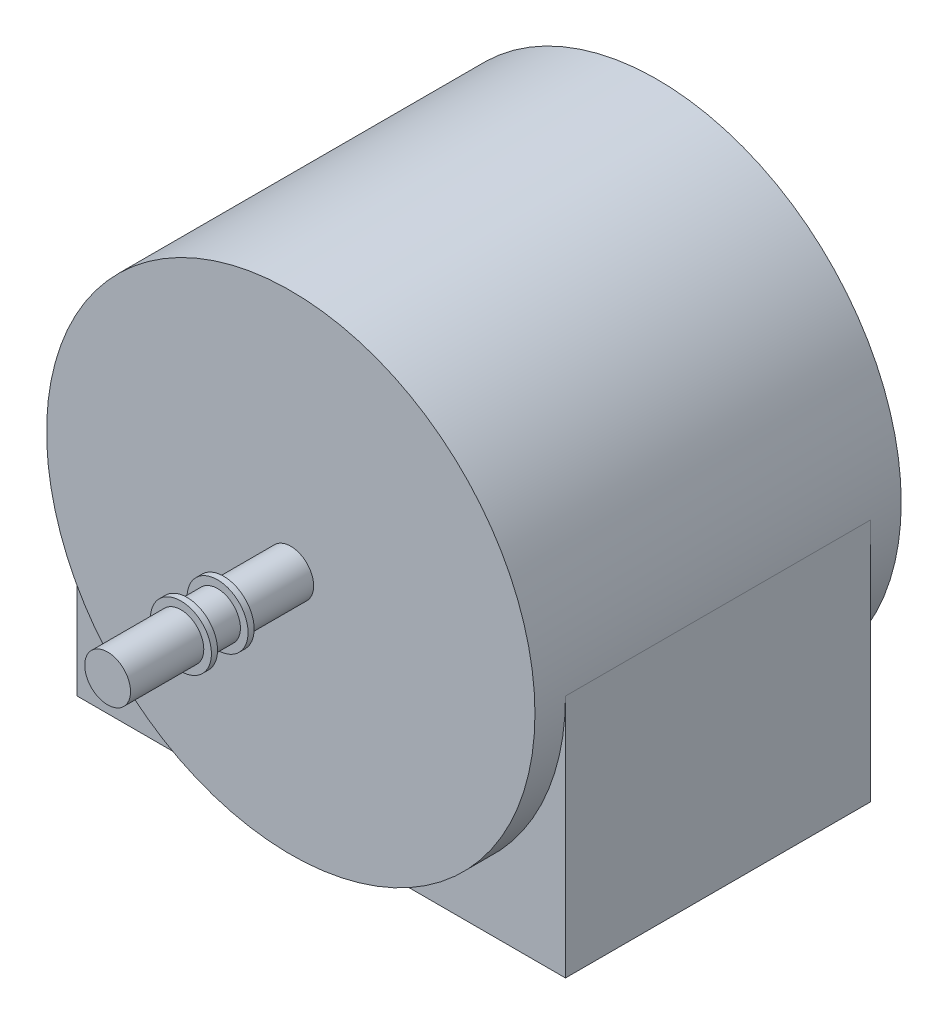
ISO-10303-21;
HEADER;
FILE_DESCRIPTION(('STEP AP214'),'2;1');
FILE_NAME('part.step','',(''),(''),'','','');
FILE_SCHEMA(('AUTOMOTIVE_DESIGN { 1 0 10303 214 1 1 1 1 }'));
ENDSEC;
DATA;
#1=APPLICATION_CONTEXT('core data for automotive mechanical design processes');
#2=APPLICATION_PROTOCOL_DEFINITION('international standard','automotive_design',2000,#1);
#3=PRODUCT_CONTEXT('',#1,'mechanical');
#4=PRODUCT('Part','Part','',(#3));
#5=PRODUCT_RELATED_PRODUCT_CATEGORY('part','',(#4));
#6=PRODUCT_DEFINITION_FORMATION('','',#4);
#7=PRODUCT_DEFINITION_CONTEXT('part definition',#1,'design');
#8=PRODUCT_DEFINITION('design','',#6,#7);
#9=PRODUCT_DEFINITION_SHAPE('','',#8);
#10=(LENGTH_UNIT() NAMED_UNIT(*) SI_UNIT(.MILLI.,.METRE.));
#11=(NAMED_UNIT(*) PLANE_ANGLE_UNIT() SI_UNIT($,.RADIAN.));
#12=(NAMED_UNIT(*) SI_UNIT($,.STERADIAN.) SOLID_ANGLE_UNIT());
#13=UNCERTAINTY_MEASURE_WITH_UNIT(LENGTH_MEASURE(1.E-05),#10,'distance_accuracy_value','');
#14=(GEOMETRIC_REPRESENTATION_CONTEXT(3) GLOBAL_UNCERTAINTY_ASSIGNED_CONTEXT((#13)) GLOBAL_UNIT_ASSIGNED_CONTEXT((#10,
#11,#12)) REPRESENTATION_CONTEXT('',''));
#15=CARTESIAN_POINT('',(0.,0.,0.));
#16=DIRECTION('',(0.,0.,1.));
#17=DIRECTION('',(1.,0.,0.));
#18=AXIS2_PLACEMENT_3D('',#15,#16,#17);
#19=CARTESIAN_POINT('',(0.,0.,180.));
#20=DIRECTION('',(0.,0.,-1.));
#21=DIRECTION('',(-1.,0.,0.));
#22=AXIS2_PLACEMENT_3D('',#19,#20,#21);
#23=CYLINDRICAL_SURFACE('',#22,7.5);
#24=CARTESIAN_POINT('',(0.,0.,144.));
#25=DIRECTION('',(0.,0.,1.));
#26=DIRECTION('',(1.,0.,0.));
#27=AXIS2_PLACEMENT_3D('',#24,#25,#26);
#28=CIRCLE('',#27,7.5);
#29=CARTESIAN_POINT('',(7.5,0.,144.));
#30=VERTEX_POINT('',#29);
#31=EDGE_CURVE('E177',#30,#30,#28,.T.);
#32=ORIENTED_EDGE('',*,*,#31,.T.);
#33=EDGE_LOOP('',(#32));
#34=FACE_BOUND('',#33,.T.);
#35=CARTESIAN_POINT('',(0.,0.,154.));
#36=DIRECTION('',(0.,0.,1.));
#37=DIRECTION('',(1.,0.,0.));
#38=AXIS2_PLACEMENT_3D('',#35,#36,#37);
#39=CIRCLE('',#38,7.5);
#40=CARTESIAN_POINT('',(7.5,0.,154.));
#41=VERTEX_POINT('',#40);
#42=EDGE_CURVE('E12',#41,#41,#39,.T.);
#43=ORIENTED_EDGE('',*,*,#42,.F.);
#44=EDGE_LOOP('',(#43));
#45=FACE_BOUND('',#44,.T.);
#46=ADVANCED_FACE('F65',(#34,#45),#23,.T.);
#47=CARTESIAN_POINT('',(0.,0.,120.));
#48=DIRECTION('',(0.,0.,1.));
#49=DIRECTION('',(1.,0.,0.));
#50=AXIS2_PLACEMENT_3D('',#47,#48,#49);
#51=CIRCLE('',#50,7.5);
#52=CARTESIAN_POINT('',(7.5,0.,120.));
#53=VERTEX_POINT('',#52);
#54=EDGE_CURVE('E180',#53,#53,#51,.T.);
#55=ORIENTED_EDGE('',*,*,#54,.T.);
#56=EDGE_LOOP('',(#55));
#57=FACE_BOUND('',#56,.T.);
#58=CARTESIAN_POINT('',(0.,0.,142.));
#59=DIRECTION('',(0.,0.,1.));
#60=DIRECTION('',(1.,0.,0.));
#61=AXIS2_PLACEMENT_3D('',#58,#59,#60);
#62=CIRCLE('',#61,7.5);
#63=CARTESIAN_POINT('',(7.5,0.,142.));
#64=VERTEX_POINT('',#63);
#65=EDGE_CURVE('E74',#64,#64,#62,.T.);
#66=ORIENTED_EDGE('',*,*,#65,.F.);
#67=EDGE_LOOP('',(#66));
#68=FACE_BOUND('',#67,.T.);
#69=ADVANCED_FACE('F188',(#57,#68),#23,.T.);
#70=CARTESIAN_POINT('',(0.,0.,120.));
#71=DIRECTION('',(0.,0.,-1.));
#72=DIRECTION('',(-1.,0.,0.));
#73=AXIS2_PLACEMENT_3D('',#70,#71,#72);
#74=CYLINDRICAL_SURFACE('',#73,80.);
#75=DIRECTION('',(0.,0.,-1.));
#76=VECTOR('',#75,1.);
#77=CARTESIAN_POINT('',(-80.,0.,110.));
#78=LINE('',#77,#76);
#79=CARTESIAN_POINT('',(-80.,0.,110.));
#80=VERTEX_POINT('',#79);
#81=CARTESIAN_POINT('',(-80.,0.,10.));
#82=VERTEX_POINT('',#81);
#83=EDGE_CURVE('E121',#80,#82,#78,.T.);
#84=ORIENTED_EDGE('',*,*,#83,.F.);
#85=CARTESIAN_POINT('',(0.,0.,110.));
#86=DIRECTION('',(0.,0.,1.));
#87=DIRECTION('',(1.,0.,0.));
#88=AXIS2_PLACEMENT_3D('',#85,#86,#87);
#89=CIRCLE('',#88,80.);
#90=CARTESIAN_POINT('',(0.,-80.,110.));
#91=VERTEX_POINT('',#90);
#92=EDGE_CURVE('E122',#80,#91,#89,.T.);
#93=ORIENTED_EDGE('',*,*,#92,.T.);
#94=CARTESIAN_POINT('',(0.,0.,110.));
#95=DIRECTION('',(0.,0.,1.));
#96=DIRECTION('',(1.,0.,0.));
#97=AXIS2_PLACEMENT_3D('',#94,#95,#96);
#98=CIRCLE('',#97,80.);
#99=CARTESIAN_POINT('',(80.,0.,110.));
#100=VERTEX_POINT('',#99);
#101=EDGE_CURVE('E81',#91,#100,#98,.T.);
#102=ORIENTED_EDGE('',*,*,#101,.T.);
#103=DIRECTION('',(0.,0.,-1.));
#104=VECTOR('',#103,1.);
#105=CARTESIAN_POINT('',(80.,0.,110.));
#106=LINE('',#105,#104);
#107=CARTESIAN_POINT('',(80.,0.,10.));
#108=VERTEX_POINT('',#107);
#109=EDGE_CURVE('E148',#100,#108,#106,.T.);
#110=ORIENTED_EDGE('',*,*,#109,.T.);
#111=CARTESIAN_POINT('',(0.,0.,10.));
#112=DIRECTION('',(0.,0.,1.));
#113=DIRECTION('',(1.,0.,0.));
#114=AXIS2_PLACEMENT_3D('',#111,#112,#113);
#115=CIRCLE('',#114,80.);
#116=CARTESIAN_POINT('',(0.,-80.,9.99999999999999));
#117=VERTEX_POINT('',#116);
#118=EDGE_CURVE('E137',#117,#108,#115,.T.);
#119=ORIENTED_EDGE('',*,*,#118,.F.);
#120=CARTESIAN_POINT('',(0.,0.,10.));
#121=DIRECTION('',(0.,0.,1.));
#122=DIRECTION('',(1.,0.,0.));
#123=AXIS2_PLACEMENT_3D('',#120,#121,#122);
#124=CIRCLE('',#123,80.);
#125=EDGE_CURVE('E89',#82,#117,#124,.T.);
#126=ORIENTED_EDGE('',*,*,#125,.F.);
#127=EDGE_LOOP('',(#84,#93,#102,#110,#119,#126));
#128=FACE_BOUND('',#127,.T.);
#129=CARTESIAN_POINT('',(0.,0.,120.));
#130=DIRECTION('',(0.,0.,1.));
#131=DIRECTION('',(1.,0.,0.));
#132=AXIS2_PLACEMENT_3D('',#129,#130,#131);
#133=CIRCLE('',#132,80.);
#134=CARTESIAN_POINT('',(80.,0.,120.));
#135=VERTEX_POINT('',#134);
#136=EDGE_CURVE('E160',#135,#135,#133,.T.);
#137=ORIENTED_EDGE('',*,*,#136,.F.);
#138=EDGE_LOOP('',(#137));
#139=FACE_BOUND('',#138,.T.);
#140=CARTESIAN_POINT('',(0.,0.,0.));
#141=DIRECTION('',(0.,0.,1.));
#142=DIRECTION('',(1.,0.,0.));
#143=AXIS2_PLACEMENT_3D('',#140,#141,#142);
#144=CIRCLE('',#143,80.);
#145=CARTESIAN_POINT('',(80.,0.,0.));
#146=VERTEX_POINT('',#145);
#147=EDGE_CURVE('E159',#146,#146,#144,.T.);
#148=ORIENTED_EDGE('',*,*,#147,.T.);
#149=EDGE_LOOP('',(#148));
#150=FACE_BOUND('',#149,.T.);
#151=ADVANCED_FACE('F67',(#128,#139,#150),#74,.T.);
#152=CARTESIAN_POINT('',(0.,0.,120.));
#153=DIRECTION('',(0.,0.,1.));
#154=DIRECTION('',(1.,0.,0.));
#155=AXIS2_PLACEMENT_3D('',#152,#153,#154);
#156=PLANE('',#155);
#157=ORIENTED_EDGE('',*,*,#54,.F.);
#158=EDGE_LOOP('',(#157));
#159=FACE_BOUND('',#158,.T.);
#160=ORIENTED_EDGE('',*,*,#136,.T.);
#161=EDGE_LOOP('',(#160));
#162=FACE_BOUND('',#161,.T.);
#163=ADVANCED_FACE('F198',(#159,#162),#156,.T.);
#164=CARTESIAN_POINT('',(0.,0.,0.));
#165=DIRECTION('',(0.,0.,1.));
#166=DIRECTION('',(1.,0.,0.));
#167=AXIS2_PLACEMENT_3D('',#164,#165,#166);
#168=PLANE('',#167);
#169=ORIENTED_EDGE('',*,*,#147,.F.);
#170=EDGE_LOOP('',(#169));
#171=FACE_BOUND('',#170,.T.);
#172=ADVANCED_FACE('F246',(#171),#168,.F.);
#173=CARTESIAN_POINT('',(0.,-80.,110.));
#174=DIRECTION('',(0.,1.,0.));
#175=DIRECTION('',(0.,0.,1.));
#176=AXIS2_PLACEMENT_3D('',#173,#174,#175);
#177=PLANE('',#176);
#178=CARTESIAN_POINT('',(-30.,-80.,30.));
#179=DIRECTION('',(0.,1.,0.));
#180=DIRECTION('',(0.,0.,1.));
#181=AXIS2_PLACEMENT_3D('',#178,#179,#180);
#182=CIRCLE('',#181,5.);
#183=CARTESIAN_POINT('',(-30.,-80.,35.));
#184=VERTEX_POINT('',#183);
#185=EDGE_CURVE('E174',#184,#184,#182,.F.);
#186=ORIENTED_EDGE('',*,*,#185,.F.);
#187=EDGE_LOOP('',(#186));
#188=FACE_BOUND('',#187,.T.);
#189=CARTESIAN_POINT('',(-30.,-80.,90.));
#190=DIRECTION('',(0.,1.,0.));
#191=DIRECTION('',(0.,0.,1.));
#192=AXIS2_PLACEMENT_3D('',#189,#190,#191);
#193=CIRCLE('',#192,5.);
#194=CARTESIAN_POINT('',(-30.,-80.,95.));
#195=VERTEX_POINT('',#194);
#196=EDGE_CURVE('E171',#195,#195,#193,.F.);
#197=ORIENTED_EDGE('',*,*,#196,.F.);
#198=EDGE_LOOP('',(#197));
#199=FACE_BOUND('',#198,.T.);
#200=CARTESIAN_POINT('',(30.,-80.,30.));
#201=DIRECTION('',(0.,1.,0.));
#202=DIRECTION('',(0.,0.,1.));
#203=AXIS2_PLACEMENT_3D('',#200,#201,#202);
#204=CIRCLE('',#203,5.);
#205=CARTESIAN_POINT('',(30.,-80.,35.));
#206=VERTEX_POINT('',#205);
#207=EDGE_CURVE('E168',#206,#206,#204,.F.);
#208=ORIENTED_EDGE('',*,*,#207,.F.);
#209=EDGE_LOOP('',(#208));
#210=FACE_BOUND('',#209,.T.);
#211=CARTESIAN_POINT('',(30.,-80.,90.));
#212=DIRECTION('',(0.,1.,0.));
#213=DIRECTION('',(0.,0.,1.));
#214=AXIS2_PLACEMENT_3D('',#211,#212,#213);
#215=CIRCLE('',#214,5.);
#216=CARTESIAN_POINT('',(30.,-80.,95.));
#217=VERTEX_POINT('',#216);
#218=EDGE_CURVE('E163',#217,#217,#215,.F.);
#219=ORIENTED_EDGE('',*,*,#218,.F.);
#220=EDGE_LOOP('',(#219));
#221=FACE_BOUND('',#220,.T.);
#222=DIRECTION('',(1.,0.,0.));
#223=VECTOR('',#222,1.);
#224=CARTESIAN_POINT('',(0.,-80.,10.));
#225=LINE('',#224,#223);
#226=CARTESIAN_POINT('',(80.,-80.,10.));
#227=VERTEX_POINT('',#226);
#228=EDGE_CURVE('E151',#117,#227,#225,.T.);
#229=ORIENTED_EDGE('',*,*,#228,.T.);
#230=DIRECTION('',(0.,0.,-1.));
#231=VECTOR('',#230,1.);
#232=CARTESIAN_POINT('',(80.,-80.,110.));
#233=LINE('',#232,#231);
#234=CARTESIAN_POINT('',(80.,-80.,110.));
#235=VERTEX_POINT('',#234);
#236=EDGE_CURVE('E156',#235,#227,#233,.T.);
#237=ORIENTED_EDGE('',*,*,#236,.F.);
#238=DIRECTION('',(1.,0.,0.));
#239=VECTOR('',#238,1.);
#240=CARTESIAN_POINT('',(0.,-80.,110.));
#241=LINE('',#240,#239);
#242=EDGE_CURVE('E143',#91,#235,#241,.T.);
#243=ORIENTED_EDGE('',*,*,#242,.F.);
#244=DIRECTION('',(1.,0.,0.));
#245=VECTOR('',#244,1.);
#246=CARTESIAN_POINT('',(0.,-80.,110.));
#247=LINE('',#246,#245);
#248=CARTESIAN_POINT('',(-80.,-80.,110.));
#249=VERTEX_POINT('',#248);
#250=EDGE_CURVE('E129',#249,#91,#247,.T.);
#251=ORIENTED_EDGE('',*,*,#250,.F.);
#252=DIRECTION('',(0.,0.,-1.));
#253=VECTOR('',#252,1.);
#254=CARTESIAN_POINT('',(-80.,-80.,110.));
#255=LINE('',#254,#253);
#256=CARTESIAN_POINT('',(-80.,-80.,10.));
#257=VERTEX_POINT('',#256);
#258=EDGE_CURVE('E118',#249,#257,#255,.T.);
#259=ORIENTED_EDGE('',*,*,#258,.T.);
#260=DIRECTION('',(1.,0.,0.));
#261=VECTOR('',#260,1.);
#262=CARTESIAN_POINT('',(0.,-80.,10.));
#263=LINE('',#262,#261);
#264=EDGE_CURVE('E126',#257,#117,#263,.T.);
#265=ORIENTED_EDGE('',*,*,#264,.T.);
#266=EDGE_LOOP('',(#229,#237,#243,#251,#259,#265));
#267=FACE_BOUND('',#266,.T.);
#268=ADVANCED_FACE('F125',(#188,#199,#210,#221,#267),#177,.F.);
#269=CARTESIAN_POINT('',(80.,0.,110.));
#270=DIRECTION('',(-1.,0.,0.));
#271=DIRECTION('',(0.,0.,1.));
#272=AXIS2_PLACEMENT_3D('',#269,#270,#271);
#273=PLANE('',#272);
#274=DIRECTION('',(0.,1.,0.));
#275=VECTOR('',#274,1.);
#276=CARTESIAN_POINT('',(80.,0.,10.));
#277=LINE('',#276,#275);
#278=EDGE_CURVE('E144',#227,#108,#277,.T.);
#279=ORIENTED_EDGE('',*,*,#278,.T.);
#280=ORIENTED_EDGE('',*,*,#109,.F.);
#281=DIRECTION('',(0.,1.,0.));
#282=VECTOR('',#281,1.);
#283=CARTESIAN_POINT('',(80.,0.,110.));
#284=LINE('',#283,#282);
#285=EDGE_CURVE('E146',#235,#100,#284,.T.);
#286=ORIENTED_EDGE('',*,*,#285,.F.);
#287=ORIENTED_EDGE('',*,*,#236,.T.);
#288=EDGE_LOOP('',(#279,#280,#286,#287));
#289=FACE_BOUND('',#288,.T.);
#290=ADVANCED_FACE('F245',(#289),#273,.F.);
#291=CARTESIAN_POINT('',(0.,0.,110.));
#292=DIRECTION('',(0.,0.,1.));
#293=DIRECTION('',(1.,0.,0.));
#294=AXIS2_PLACEMENT_3D('',#291,#292,#293);
#295=PLANE('',#294);
#296=ORIENTED_EDGE('',*,*,#101,.F.);
#297=ORIENTED_EDGE('',*,*,#242,.T.);
#298=ORIENTED_EDGE('',*,*,#285,.T.);
#299=EDGE_LOOP('',(#296,#297,#298));
#300=FACE_BOUND('',#299,.T.);
#301=ADVANCED_FACE('F253',(#300),#295,.T.);
#302=CARTESIAN_POINT('',(0.,0.,10.));
#303=DIRECTION('',(0.,0.,1.));
#304=DIRECTION('',(1.,0.,0.));
#305=AXIS2_PLACEMENT_3D('',#302,#303,#304);
#306=PLANE('',#305);
#307=ORIENTED_EDGE('',*,*,#118,.T.);
#308=ORIENTED_EDGE('',*,*,#278,.F.);
#309=ORIENTED_EDGE('',*,*,#228,.F.);
#310=EDGE_LOOP('',(#307,#308,#309));
#311=FACE_BOUND('',#310,.T.);
#312=ADVANCED_FACE('F402',(#311),#306,.F.);
#313=CARTESIAN_POINT('',(-80.,0.,110.));
#314=DIRECTION('',(1.,0.,0.));
#315=DIRECTION('',(0.,0.,-1.));
#316=AXIS2_PLACEMENT_3D('',#313,#314,#315);
#317=PLANE('',#316);
#318=DIRECTION('',(0.,-1.,0.));
#319=VECTOR('',#318,1.);
#320=CARTESIAN_POINT('',(-80.,0.,10.));
#321=LINE('',#320,#319);
#322=EDGE_CURVE('E115',#82,#257,#321,.T.);
#323=ORIENTED_EDGE('',*,*,#322,.T.);
#324=ORIENTED_EDGE('',*,*,#258,.F.);
#325=DIRECTION('',(0.,-1.,0.));
#326=VECTOR('',#325,1.);
#327=CARTESIAN_POINT('',(-80.,0.,110.));
#328=LINE('',#327,#326);
#329=EDGE_CURVE('E130',#80,#249,#328,.T.);
#330=ORIENTED_EDGE('',*,*,#329,.F.);
#331=ORIENTED_EDGE('',*,*,#83,.T.);
#332=EDGE_LOOP('',(#323,#324,#330,#331));
#333=FACE_BOUND('',#332,.T.);
#334=ADVANCED_FACE('F117',(#333),#317,.F.);
#335=CARTESIAN_POINT('',(0.,0.,110.));
#336=DIRECTION('',(0.,0.,1.));
#337=DIRECTION('',(1.,0.,0.));
#338=AXIS2_PLACEMENT_3D('',#335,#336,#337);
#339=PLANE('',#338);
#340=ORIENTED_EDGE('',*,*,#92,.F.);
#341=ORIENTED_EDGE('',*,*,#329,.T.);
#342=ORIENTED_EDGE('',*,*,#250,.T.);
#343=EDGE_LOOP('',(#340,#341,#342));
#344=FACE_BOUND('',#343,.T.);
#345=ADVANCED_FACE('F401',(#344),#339,.T.);
#346=CARTESIAN_POINT('',(0.,0.,10.));
#347=DIRECTION('',(0.,0.,1.));
#348=DIRECTION('',(1.,0.,0.));
#349=AXIS2_PLACEMENT_3D('',#346,#347,#348);
#350=PLANE('',#349);
#351=ORIENTED_EDGE('',*,*,#125,.T.);
#352=ORIENTED_EDGE('',*,*,#264,.F.);
#353=ORIENTED_EDGE('',*,*,#322,.F.);
#354=EDGE_LOOP('',(#351,#352,#353));
#355=FACE_BOUND('',#354,.T.);
#356=ADVANCED_FACE('F132',(#355),#350,.F.);
#357=CARTESIAN_POINT('',(30.,-85.,90.));
#358=DIRECTION('',(0.,1.,0.));
#359=DIRECTION('',(0.,0.,1.));
#360=AXIS2_PLACEMENT_3D('',#357,#358,#359);
#361=CYLINDRICAL_SURFACE('',#360,5.);
#362=CARTESIAN_POINT('',(30.,-85.,90.));
#363=DIRECTION('',(0.,-1.,0.));
#364=DIRECTION('',(0.,0.,-1.));
#365=AXIS2_PLACEMENT_3D('',#362,#363,#364);
#366=CIRCLE('',#365,5.);
#367=CARTESIAN_POINT('',(30.,-85.,85.));
#368=VERTEX_POINT('',#367);
#369=EDGE_CURVE('E141',#368,#368,#366,.T.);
#370=ORIENTED_EDGE('',*,*,#369,.F.);
#371=EDGE_LOOP('',(#370));
#372=FACE_BOUND('',#371,.T.);
#373=ORIENTED_EDGE('',*,*,#218,.T.);
#374=EDGE_LOOP('',(#373));
#375=FACE_BOUND('',#374,.T.);
#376=ADVANCED_FACE('F238',(#372,#375),#361,.T.);
#377=CARTESIAN_POINT('',(30.,-85.,90.));
#378=DIRECTION('',(0.,-1.,0.));
#379=DIRECTION('',(0.,0.,-1.));
#380=AXIS2_PLACEMENT_3D('',#377,#378,#379);
#381=PLANE('',#380);
#382=ORIENTED_EDGE('',*,*,#369,.T.);
#383=EDGE_LOOP('',(#382));
#384=FACE_BOUND('',#383,.T.);
#385=ADVANCED_FACE('F236',(#384),#381,.T.);
#386=CARTESIAN_POINT('',(30.,-85.,30.));
#387=DIRECTION('',(0.,1.,0.));
#388=DIRECTION('',(0.,0.,1.));
#389=AXIS2_PLACEMENT_3D('',#386,#387,#388);
#390=CYLINDRICAL_SURFACE('',#389,5.);
#391=CARTESIAN_POINT('',(30.,-85.,30.));
#392=DIRECTION('',(0.,-1.,0.));
#393=DIRECTION('',(0.,0.,1.));
#394=AXIS2_PLACEMENT_3D('',#391,#392,#393);
#395=CIRCLE('',#394,5.);
#396=CARTESIAN_POINT('',(30.,-85.,35.));
#397=VERTEX_POINT('',#396);
#398=EDGE_CURVE('E230',#397,#397,#395,.T.);
#399=ORIENTED_EDGE('',*,*,#398,.F.);
#400=EDGE_LOOP('',(#399));
#401=FACE_BOUND('',#400,.T.);
#402=ORIENTED_EDGE('',*,*,#207,.T.);
#403=EDGE_LOOP('',(#402));
#404=FACE_BOUND('',#403,.T.);
#405=ADVANCED_FACE('F390',(#401,#404),#390,.T.);
#406=CARTESIAN_POINT('',(30.,-85.,30.));
#407=DIRECTION('',(0.,1.,0.));
#408=DIRECTION('',(0.,0.,1.));
#409=AXIS2_PLACEMENT_3D('',#406,#407,#408);
#410=PLANE('',#409);
#411=ORIENTED_EDGE('',*,*,#398,.T.);
#412=EDGE_LOOP('',(#411));
#413=FACE_BOUND('',#412,.T.);
#414=ADVANCED_FACE('F385',(#413),#410,.F.);
#415=CARTESIAN_POINT('',(-30.,-85.,90.));
#416=DIRECTION('',(0.,1.,0.));
#417=DIRECTION('',(0.,0.,1.));
#418=AXIS2_PLACEMENT_3D('',#415,#416,#417);
#419=CYLINDRICAL_SURFACE('',#418,5.);
#420=CARTESIAN_POINT('',(-30.,-85.,90.));
#421=DIRECTION('',(0.,-1.,0.));
#422=DIRECTION('',(0.,0.,1.));
#423=AXIS2_PLACEMENT_3D('',#420,#421,#422);
#424=CIRCLE('',#423,5.);
#425=CARTESIAN_POINT('',(-30.,-85.,95.));
#426=VERTEX_POINT('',#425);
#427=EDGE_CURVE('E221',#426,#426,#424,.T.);
#428=ORIENTED_EDGE('',*,*,#427,.F.);
#429=EDGE_LOOP('',(#428));
#430=FACE_BOUND('',#429,.T.);
#431=ORIENTED_EDGE('',*,*,#196,.T.);
#432=EDGE_LOOP('',(#431));
#433=FACE_BOUND('',#432,.T.);
#434=ADVANCED_FACE('F382',(#430,#433),#419,.T.);
#435=CARTESIAN_POINT('',(-30.,-85.,90.));
#436=DIRECTION('',(0.,1.,0.));
#437=DIRECTION('',(0.,0.,1.));
#438=AXIS2_PLACEMENT_3D('',#435,#436,#437);
#439=PLANE('',#438);
#440=ORIENTED_EDGE('',*,*,#427,.T.);
#441=EDGE_LOOP('',(#440));
#442=FACE_BOUND('',#441,.T.);
#443=ADVANCED_FACE('F379',(#442),#439,.F.);
#444=CARTESIAN_POINT('',(-30.,-85.,30.));
#445=DIRECTION('',(0.,1.,0.));
#446=DIRECTION('',(0.,0.,1.));
#447=AXIS2_PLACEMENT_3D('',#444,#445,#446);
#448=CYLINDRICAL_SURFACE('',#447,5.);
#449=CARTESIAN_POINT('',(-30.,-85.,30.));
#450=DIRECTION('',(0.,-1.,0.));
#451=DIRECTION('',(0.,0.,-1.));
#452=AXIS2_PLACEMENT_3D('',#449,#450,#451);
#453=CIRCLE('',#452,5.);
#454=CARTESIAN_POINT('',(-30.,-85.,25.));
#455=VERTEX_POINT('',#454);
#456=EDGE_CURVE('E218',#455,#455,#453,.T.);
#457=ORIENTED_EDGE('',*,*,#456,.F.);
#458=EDGE_LOOP('',(#457));
#459=FACE_BOUND('',#458,.T.);
#460=ORIENTED_EDGE('',*,*,#185,.T.);
#461=EDGE_LOOP('',(#460));
#462=FACE_BOUND('',#461,.T.);
#463=ADVANCED_FACE('F376',(#459,#462),#448,.T.);
#464=CARTESIAN_POINT('',(-30.,-85.,30.));
#465=DIRECTION('',(0.,-1.,0.));
#466=DIRECTION('',(0.,0.,-1.));
#467=AXIS2_PLACEMENT_3D('',#464,#465,#466);
#468=PLANE('',#467);
#469=ORIENTED_EDGE('',*,*,#456,.T.);
#470=EDGE_LOOP('',(#469));
#471=FACE_BOUND('',#470,.T.);
#472=ADVANCED_FACE('F278',(#471),#468,.T.);
#473=CARTESIAN_POINT('',(0.,0.,142.));
#474=DIRECTION('',(0.,0.,1.));
#475=DIRECTION('',(1.,0.,0.));
#476=AXIS2_PLACEMENT_3D('',#473,#474,#475);
#477=CYLINDRICAL_SURFACE('',#476,10.);
#478=CARTESIAN_POINT('',(0.,0.,142.));
#479=DIRECTION('',(0.,0.,1.));
#480=DIRECTION('',(1.,0.,0.));
#481=AXIS2_PLACEMENT_3D('',#478,#479,#480);
#482=CIRCLE('',#481,10.);
#483=CARTESIAN_POINT('',(10.,0.,142.));
#484=VERTEX_POINT('',#483);
#485=EDGE_CURVE('E181',#484,#484,#482,.T.);
#486=ORIENTED_EDGE('',*,*,#485,.T.);
#487=EDGE_LOOP('',(#486));
#488=FACE_BOUND('',#487,.T.);
#489=CARTESIAN_POINT('',(0.,0.,144.));
#490=DIRECTION('',(0.,0.,1.));
#491=DIRECTION('',(1.,0.,0.));
#492=AXIS2_PLACEMENT_3D('',#489,#490,#491);
#493=CIRCLE('',#492,10.);
#494=CARTESIAN_POINT('',(10.,0.,144.));
#495=VERTEX_POINT('',#494);
#496=EDGE_CURVE('E225',#495,#495,#493,.T.);
#497=ORIENTED_EDGE('',*,*,#496,.F.);
#498=EDGE_LOOP('',(#497));
#499=FACE_BOUND('',#498,.T.);
#500=ADVANCED_FACE('F297',(#488,#499),#477,.T.);
#501=CARTESIAN_POINT('',(0.,0.,142.));
#502=DIRECTION('',(0.,0.,1.));
#503=DIRECTION('',(1.,0.,0.));
#504=AXIS2_PLACEMENT_3D('',#501,#502,#503);
#505=PLANE('',#504);
#506=ORIENTED_EDGE('',*,*,#65,.T.);
#507=EDGE_LOOP('',(#506));
#508=FACE_BOUND('',#507,.T.);
#509=ORIENTED_EDGE('',*,*,#485,.F.);
#510=EDGE_LOOP('',(#509));
#511=FACE_BOUND('',#510,.T.);
#512=ADVANCED_FACE('F185',(#508,#511),#505,.F.);
#513=CARTESIAN_POINT('',(0.,0.,144.));
#514=DIRECTION('',(0.,0.,1.));
#515=DIRECTION('',(1.,0.,0.));
#516=AXIS2_PLACEMENT_3D('',#513,#514,#515);
#517=PLANE('',#516);
#518=ORIENTED_EDGE('',*,*,#31,.F.);
#519=EDGE_LOOP('',(#518));
#520=FACE_BOUND('',#519,.T.);
#521=ORIENTED_EDGE('',*,*,#496,.T.);
#522=EDGE_LOOP('',(#521));
#523=FACE_BOUND('',#522,.T.);
#524=ADVANCED_FACE('F310',(#520,#523),#517,.T.);
#525=CARTESIAN_POINT('',(0.,0.,156.));
#526=DIRECTION('',(0.,0.,-1.));
#527=DIRECTION('',(-1.,0.,0.));
#528=AXIS2_PLACEMENT_3D('',#525,#526,#527);
#529=CYLINDRICAL_SURFACE('',#528,10.);
#530=CARTESIAN_POINT('',(0.,0.,156.));
#531=DIRECTION('',(0.,0.,1.));
#532=DIRECTION('',(1.,0.,0.));
#533=AXIS2_PLACEMENT_3D('',#530,#531,#532);
#534=CIRCLE('',#533,10.);
#535=CARTESIAN_POINT('',(10.,0.,156.));
#536=VERTEX_POINT('',#535);
#537=EDGE_CURVE('E361',#536,#536,#534,.T.);
#538=ORIENTED_EDGE('',*,*,#537,.F.);
#539=EDGE_LOOP('',(#538));
#540=FACE_BOUND('',#539,.T.);
#541=CARTESIAN_POINT('',(0.,0.,154.));
#542=DIRECTION('',(0.,0.,1.));
#543=DIRECTION('',(1.,0.,0.));
#544=AXIS2_PLACEMENT_3D('',#541,#542,#543);
#545=CIRCLE('',#544,10.);
#546=CARTESIAN_POINT('',(10.,0.,154.));
#547=VERTEX_POINT('',#546);
#548=EDGE_CURVE('E359',#547,#547,#545,.T.);
#549=ORIENTED_EDGE('',*,*,#548,.T.);
#550=EDGE_LOOP('',(#549));
#551=FACE_BOUND('',#550,.T.);
#552=ADVANCED_FACE('F319',(#540,#551),#529,.T.);
#553=CARTESIAN_POINT('',(0.,0.,156.));
#554=DIRECTION('',(0.,0.,1.));
#555=DIRECTION('',(1.,0.,0.));
#556=AXIS2_PLACEMENT_3D('',#553,#554,#555);
#557=PLANE('',#556);
#558=CARTESIAN_POINT('',(0.,0.,156.));
#559=DIRECTION('',(0.,0.,1.));
#560=DIRECTION('',(1.,0.,0.));
#561=AXIS2_PLACEMENT_3D('',#558,#559,#560);
#562=CIRCLE('',#561,7.5);
#563=CARTESIAN_POINT('',(7.5,0.,156.));
#564=VERTEX_POINT('',#563);
#565=EDGE_CURVE('E69',#564,#564,#562,.T.);
#566=ORIENTED_EDGE('',*,*,#565,.F.);
#567=EDGE_LOOP('',(#566));
#568=FACE_BOUND('',#567,.T.);
#569=ORIENTED_EDGE('',*,*,#537,.T.);
#570=EDGE_LOOP('',(#569));
#571=FACE_BOUND('',#570,.T.);
#572=ADVANCED_FACE('F334',(#568,#571),#557,.T.);
#573=CARTESIAN_POINT('',(0.,0.,154.));
#574=DIRECTION('',(0.,0.,1.));
#575=DIRECTION('',(1.,0.,0.));
#576=AXIS2_PLACEMENT_3D('',#573,#574,#575);
#577=PLANE('',#576);
#578=ORIENTED_EDGE('',*,*,#42,.T.);
#579=EDGE_LOOP('',(#578));
#580=FACE_BOUND('',#579,.T.);
#581=ORIENTED_EDGE('',*,*,#548,.F.);
#582=EDGE_LOOP('',(#581));
#583=FACE_BOUND('',#582,.T.);
#584=ADVANCED_FACE('F210',(#580,#583),#577,.F.);
#585=CARTESIAN_POINT('',(0.,0.,180.));
#586=DIRECTION('',(0.,0.,1.));
#587=DIRECTION('',(1.,0.,0.));
#588=AXIS2_PLACEMENT_3D('',#585,#586,#587);
#589=PLANE('',#588);
#590=CARTESIAN_POINT('',(0.,0.,180.));
#591=DIRECTION('',(0.,0.,1.));
#592=DIRECTION('',(1.,0.,0.));
#593=AXIS2_PLACEMENT_3D('',#590,#591,#592);
#594=CIRCLE('',#593,7.5);
#595=CARTESIAN_POINT('',(7.5,0.,180.));
#596=VERTEX_POINT('',#595);
#597=EDGE_CURVE('E217',#596,#596,#594,.T.);
#598=ORIENTED_EDGE('',*,*,#597,.T.);
#599=EDGE_LOOP('',(#598));
#600=FACE_BOUND('',#599,.T.);
#601=ADVANCED_FACE('F205',(#600),#589,.T.);
#602=ORIENTED_EDGE('',*,*,#565,.T.);
#603=EDGE_LOOP('',(#602));
#604=FACE_BOUND('',#603,.T.);
#605=ORIENTED_EDGE('',*,*,#597,.F.);
#606=EDGE_LOOP('',(#605));
#607=FACE_BOUND('',#606,.T.);
#608=ADVANCED_FACE('F192',(#604,#607),#23,.T.);
#609=CLOSED_SHELL('',(#46,#69,#151,#163,#172,#268,#290,#301,#312,#334,#345,#356,#376,#385,#405,
#414,#434,#443,#463,#472,#500,#512,#524,#552,#572,#584,#601,#608));
#610=MANIFOLD_SOLID_BREP('B2',#609);
#611=ADVANCED_BREP_SHAPE_REPRESENTATION('',(#18,#610),#14);
#612=SHAPE_DEFINITION_REPRESENTATION(#9,#611);
ENDSEC;
END-ISO-10303-21;
